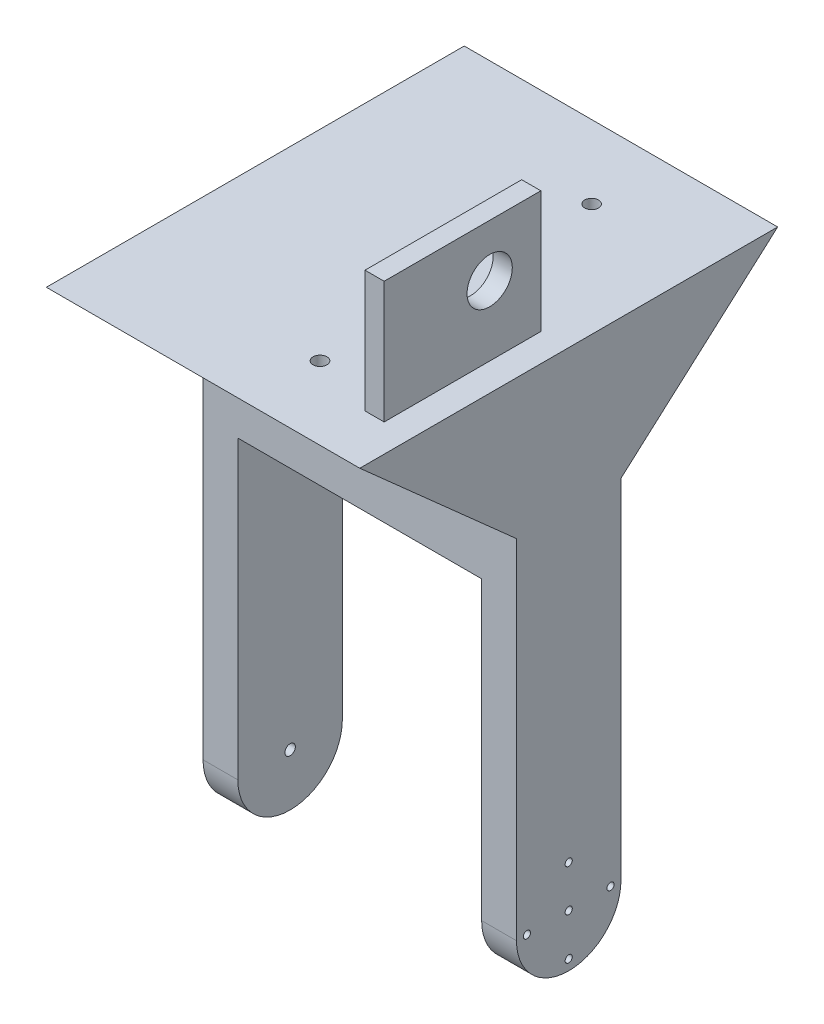
ISO-10303-21;
HEADER;
FILE_DESCRIPTION(('STEP AP214'),'2;1');
FILE_NAME('part.step','',(''),(''),'','','');
FILE_SCHEMA(('AUTOMOTIVE_DESIGN { 1 0 10303 214 1 1 1 1 }'));
ENDSEC;
DATA;
#1=APPLICATION_CONTEXT('core data for automotive mechanical design processes');
#2=APPLICATION_PROTOCOL_DEFINITION('international standard','automotive_design',2000,#1);
#3=PRODUCT_CONTEXT('',#1,'mechanical');
#4=PRODUCT('Part','Part','',(#3));
#5=PRODUCT_RELATED_PRODUCT_CATEGORY('part','',(#4));
#6=PRODUCT_DEFINITION_FORMATION('','',#4);
#7=PRODUCT_DEFINITION_CONTEXT('part definition',#1,'design');
#8=PRODUCT_DEFINITION('design','',#6,#7);
#9=PRODUCT_DEFINITION_SHAPE('','',#8);
#10=(LENGTH_UNIT() NAMED_UNIT(*) SI_UNIT(.MILLI.,.METRE.));
#11=(NAMED_UNIT(*) PLANE_ANGLE_UNIT() SI_UNIT($,.RADIAN.));
#12=(NAMED_UNIT(*) SI_UNIT($,.STERADIAN.) SOLID_ANGLE_UNIT());
#13=UNCERTAINTY_MEASURE_WITH_UNIT(LENGTH_MEASURE(1.E-05),#10,'distance_accuracy_value','');
#14=(GEOMETRIC_REPRESENTATION_CONTEXT(3) GLOBAL_UNCERTAINTY_ASSIGNED_CONTEXT((#13)) GLOBAL_UNIT_ASSIGNED_CONTEXT((#10,
#11,#12)) REPRESENTATION_CONTEXT('',''));
#15=CARTESIAN_POINT('',(0.,0.,0.));
#16=DIRECTION('',(0.,0.,1.));
#17=DIRECTION('',(1.,0.,0.));
#18=AXIS2_PLACEMENT_3D('',#15,#16,#17);
#19=CARTESIAN_POINT('',(0.,151.596692486498,-60.));
#20=DIRECTION('',(0.,1.,0.));
#21=DIRECTION('',(0.,0.,1.));
#22=AXIS2_PLACEMENT_3D('',#19,#20,#21);
#23=PLANE('',#22);
#24=CARTESIAN_POINT('',(-32.4216056612237,151.596692486498,-39.));
#25=DIRECTION('',(0.,1.,0.));
#26=DIRECTION('',(0.,0.,1.));
#27=AXIS2_PLACEMENT_3D('',#24,#25,#26);
#28=CIRCLE('',#27,1.99999999999952);
#29=CARTESIAN_POINT('',(-32.4216056612237,151.596692486498,-37.0000000000005));
#30=VERTEX_POINT('',#29);
#31=EDGE_CURVE('E289',#30,#30,#28,.T.);
#32=ORIENTED_EDGE('',*,*,#31,.F.);
#33=EDGE_LOOP('',(#32));
#34=FACE_BOUND('',#33,.T.);
#35=CARTESIAN_POINT('',(-32.4216056612237,151.596692486498,39.));
#36=DIRECTION('',(0.,1.,0.));
#37=DIRECTION('',(0.,0.,1.));
#38=AXIS2_PLACEMENT_3D('',#35,#36,#37);
#39=CIRCLE('',#38,1.99999999999948);
#40=CARTESIAN_POINT('',(-32.4216056612237,151.596692486498,40.9999999999995));
#41=VERTEX_POINT('',#40);
#42=EDGE_CURVE('E295',#41,#41,#39,.T.);
#43=ORIENTED_EDGE('',*,*,#42,.F.);
#44=EDGE_LOOP('',(#43));
#45=FACE_BOUND('',#44,.T.);
#46=DIRECTION('',(0.,0.,-1.));
#47=VECTOR('',#46,1.);
#48=CARTESIAN_POINT('',(-90.,151.596692486498,-60.));
#49=LINE('',#48,#47);
#50=CARTESIAN_POINT('',(-90.,151.596692486498,60.));
#51=VERTEX_POINT('',#50);
#52=CARTESIAN_POINT('',(-90.,151.596692486498,-60.));
#53=VERTEX_POINT('',#52);
#54=EDGE_CURVE('E170',#51,#53,#49,.T.);
#55=ORIENTED_EDGE('',*,*,#54,.F.);
#56=DIRECTION('',(-1.,0.,0.));
#57=VECTOR('',#56,1.);
#58=CARTESIAN_POINT('',(0.,151.596692486498,60.));
#59=LINE('',#58,#57);
#60=CARTESIAN_POINT('',(0.,151.596692486498,60.));
#61=VERTEX_POINT('',#60);
#62=EDGE_CURVE('E184',#61,#51,#59,.T.);
#63=ORIENTED_EDGE('',*,*,#62,.F.);
#64=DIRECTION('',(0.,0.,-1.));
#65=VECTOR('',#64,1.);
#66=CARTESIAN_POINT('',(0.,151.596692486498,-60.));
#67=LINE('',#66,#65);
#68=CARTESIAN_POINT('',(0.,151.596692486498,-60.));
#69=VERTEX_POINT('',#68);
#70=EDGE_CURVE('E178',#61,#69,#67,.T.);
#71=ORIENTED_EDGE('',*,*,#70,.T.);
#72=DIRECTION('',(-1.,0.,0.));
#73=VECTOR('',#72,1.);
#74=CARTESIAN_POINT('',(0.,151.596692486498,-60.));
#75=LINE('',#74,#73);
#76=EDGE_CURVE('E190',#69,#53,#75,.T.);
#77=ORIENTED_EDGE('',*,*,#76,.T.);
#78=EDGE_LOOP('',(#55,#63,#71,#77));
#79=FACE_BOUND('',#78,.T.);
#80=DIRECTION('',(-1.,0.,0.));
#81=VECTOR('',#80,1.);
#82=CARTESIAN_POINT('',(-8.,151.596692486498,0.));
#83=LINE('',#82,#81);
#84=CARTESIAN_POINT('',(-8.,151.596692486498,0.));
#85=VERTEX_POINT('',#84);
#86=CARTESIAN_POINT('',(-13.5,151.596692486498,0.));
#87=VERTEX_POINT('',#86);
#88=EDGE_CURVE('E311',#85,#87,#83,.T.);
#89=ORIENTED_EDGE('',*,*,#88,.F.);
#90=DIRECTION('',(0.,0.,-1.));
#91=VECTOR('',#90,1.);
#92=CARTESIAN_POINT('',(-8.,151.596692486498,45.));
#93=LINE('',#92,#91);
#94=CARTESIAN_POINT('',(-8.,151.596692486498,45.));
#95=VERTEX_POINT('',#94);
#96=EDGE_CURVE('E165',#95,#85,#93,.T.);
#97=ORIENTED_EDGE('',*,*,#96,.F.);
#98=DIRECTION('',(1.,0.,0.));
#99=VECTOR('',#98,1.);
#100=CARTESIAN_POINT('',(-8.,151.596692486498,45.));
#101=LINE('',#100,#99);
#102=CARTESIAN_POINT('',(-13.5,151.596692486498,45.));
#103=VERTEX_POINT('',#102);
#104=EDGE_CURVE('E161',#103,#95,#101,.T.);
#105=ORIENTED_EDGE('',*,*,#104,.F.);
#106=DIRECTION('',(0.,0.,1.));
#107=VECTOR('',#106,1.);
#108=CARTESIAN_POINT('',(-13.5,151.596692486498,45.));
#109=LINE('',#108,#107);
#110=EDGE_CURVE('E313',#87,#103,#109,.T.);
#111=ORIENTED_EDGE('',*,*,#110,.F.);
#112=EDGE_LOOP('',(#89,#97,#105,#111));
#113=FACE_BOUND('',#112,.T.);
#114=ADVANCED_FACE('F39',(#34,#45,#79,#113),#23,.T.);
#115=CARTESIAN_POINT('',(-10.,11.5966924864979,0.));
#116=DIRECTION('',(1.,0.,0.));
#117=DIRECTION('',(0.,0.,-1.));
#118=AXIS2_PLACEMENT_3D('',#115,#116,#117);
#119=PLANE('',#118);
#120=CARTESIAN_POINT('',(-10.,23.5966924864979,0.));
#121=DIRECTION('',(-1.,0.,0.));
#122=DIRECTION('',(0.,0.,1.));
#123=AXIS2_PLACEMENT_3D('',#120,#121,#122);
#124=CIRCLE('',#123,1.025);
#125=CARTESIAN_POINT('',(-10.,23.5966924864979,1.025));
#126=VERTEX_POINT('',#125);
#127=EDGE_CURVE('E204',#126,#126,#124,.T.);
#128=ORIENTED_EDGE('',*,*,#127,.F.);
#129=EDGE_LOOP('',(#128));
#130=FACE_BOUND('',#129,.T.);
#131=CARTESIAN_POINT('',(-10.,11.5966924864975,-11.9999999999995));
#132=DIRECTION('',(-1.,0.,0.));
#133=DIRECTION('',(0.,0.,1.));
#134=AXIS2_PLACEMENT_3D('',#131,#132,#133);
#135=CIRCLE('',#134,1.025);
#136=CARTESIAN_POINT('',(-10.,11.5966924864975,-10.9749999999995));
#137=VERTEX_POINT('',#136);
#138=EDGE_CURVE('E215',#137,#137,#135,.T.);
#139=ORIENTED_EDGE('',*,*,#138,.F.);
#140=EDGE_LOOP('',(#139));
#141=FACE_BOUND('',#140,.T.);
#142=CARTESIAN_POINT('',(-10.,-0.403307513502083,9.33507682726402E-13));
#143=DIRECTION('',(-1.,0.,0.));
#144=DIRECTION('',(0.,0.,1.));
#145=AXIS2_PLACEMENT_3D('',#142,#143,#144);
#146=CIRCLE('',#145,1.025);
#147=CARTESIAN_POINT('',(-10.,-0.403307513502083,1.02500000000093));
#148=VERTEX_POINT('',#147);
#149=EDGE_CURVE('E208',#148,#148,#146,.T.);
#150=ORIENTED_EDGE('',*,*,#149,.F.);
#151=EDGE_LOOP('',(#150));
#152=FACE_BOUND('',#151,.T.);
#153=CARTESIAN_POINT('',(-10.,11.5966924864984,12.0000000000005));
#154=DIRECTION('',(-1.,0.,0.));
#155=DIRECTION('',(0.,0.,1.));
#156=AXIS2_PLACEMENT_3D('',#153,#154,#155);
#157=CIRCLE('',#156,1.025);
#158=CARTESIAN_POINT('',(-10.,11.5966924864984,13.0250000000005));
#159=VERTEX_POINT('',#158);
#160=EDGE_CURVE('E222',#159,#159,#157,.T.);
#161=ORIENTED_EDGE('',*,*,#160,.F.);
#162=EDGE_LOOP('',(#161));
#163=FACE_BOUND('',#162,.T.);
#164=CARTESIAN_POINT('',(-10.,11.5966924864979,0.));
#165=DIRECTION('',(-1.,0.,0.));
#166=DIRECTION('',(0.,0.,1.));
#167=AXIS2_PLACEMENT_3D('',#164,#165,#166);
#168=CIRCLE('',#167,6.05);
#169=CARTESIAN_POINT('',(-10.,11.5966924864979,6.05));
#170=VERTEX_POINT('',#169);
#171=EDGE_CURVE('E231',#170,#170,#168,.T.);
#172=ORIENTED_EDGE('',*,*,#171,.F.);
#173=EDGE_LOOP('',(#172));
#174=FACE_BOUND('',#173,.T.);
#175=DIRECTION('',(0.,0.,1.));
#176=VECTOR('',#175,1.);
#177=CARTESIAN_POINT('',(-10.,96.5966924864979,-15.));
#178=LINE('',#177,#176);
#179=CARTESIAN_POINT('',(-10.,96.5966924864979,-15.));
#180=VERTEX_POINT('',#179);
#181=CARTESIAN_POINT('',(-10.,96.5966924864979,15.));
#182=VERTEX_POINT('',#181);
#183=EDGE_CURVE('E64',#180,#182,#178,.T.);
#184=ORIENTED_EDGE('',*,*,#183,.F.);
#185=DIRECTION('',(0.,1.,0.));
#186=VECTOR('',#185,1.);
#187=CARTESIAN_POINT('',(-10.,11.5966924864979,-15.));
#188=LINE('',#187,#186);
#189=CARTESIAN_POINT('',(-10.,11.5966924864979,-15.));
#190=VERTEX_POINT('',#189);
#191=EDGE_CURVE('E268',#190,#180,#188,.T.);
#192=ORIENTED_EDGE('',*,*,#191,.F.);
#193=CARTESIAN_POINT('',(-10.,11.5966924864979,0.));
#194=DIRECTION('',(1.,0.,0.));
#195=DIRECTION('',(0.,0.,-1.));
#196=AXIS2_PLACEMENT_3D('',#193,#194,#195);
#197=CIRCLE('',#196,15.);
#198=CARTESIAN_POINT('',(-10.,11.5966924864979,15.));
#199=VERTEX_POINT('',#198);
#200=EDGE_CURVE('E265',#199,#190,#197,.T.);
#201=ORIENTED_EDGE('',*,*,#200,.F.);
#202=DIRECTION('',(0.,-1.,0.));
#203=VECTOR('',#202,1.);
#204=CARTESIAN_POINT('',(-10.,11.5966924864979,15.));
#205=LINE('',#204,#203);
#206=EDGE_CURVE('E271',#182,#199,#205,.T.);
#207=ORIENTED_EDGE('',*,*,#206,.F.);
#208=EDGE_LOOP('',(#184,#192,#201,#207));
#209=FACE_BOUND('',#208,.T.);
#210=ADVANCED_FACE('F334',(#130,#141,#152,#163,#174,#209),#119,.F.);
#211=CARTESIAN_POINT('',(-10.,11.5966924864979,0.));
#212=DIRECTION('',(1.,0.,0.));
#213=DIRECTION('',(0.,0.,-1.));
#214=AXIS2_PLACEMENT_3D('',#211,#212,#213);
#215=CYLINDRICAL_SURFACE('',#214,15.);
#216=CARTESIAN_POINT('',(0.,11.5966924864979,0.));
#217=DIRECTION('',(1.,0.,0.));
#218=DIRECTION('',(0.,0.,-1.));
#219=AXIS2_PLACEMENT_3D('',#216,#217,#218);
#220=CIRCLE('',#219,15.);
#221=CARTESIAN_POINT('',(0.,11.5966924864979,15.));
#222=VERTEX_POINT('',#221);
#223=CARTESIAN_POINT('',(0.,11.5966924864979,-15.));
#224=VERTEX_POINT('',#223);
#225=EDGE_CURVE('E264',#222,#224,#220,.T.);
#226=ORIENTED_EDGE('',*,*,#225,.F.);
#227=DIRECTION('',(1.,0.,0.));
#228=VECTOR('',#227,1.);
#229=CARTESIAN_POINT('',(-10.,11.5966924864979,15.));
#230=LINE('',#229,#228);
#231=EDGE_CURVE('E11',#199,#222,#230,.T.);
#232=ORIENTED_EDGE('',*,*,#231,.F.);
#233=ORIENTED_EDGE('',*,*,#200,.T.);
#234=DIRECTION('',(1.,0.,0.));
#235=VECTOR('',#234,1.);
#236=CARTESIAN_POINT('',(-10.,11.5966924864979,-15.));
#237=LINE('',#236,#235);
#238=EDGE_CURVE('E273',#190,#224,#237,.T.);
#239=ORIENTED_EDGE('',*,*,#238,.T.);
#240=EDGE_LOOP('',(#226,#232,#233,#239));
#241=FACE_BOUND('',#240,.T.);
#242=ADVANCED_FACE('F41',(#241),#215,.T.);
#243=CARTESIAN_POINT('',(-10.,11.5966924864979,15.));
#244=DIRECTION('',(0.,0.,1.));
#245=DIRECTION('',(0.,-1.,0.));
#246=AXIS2_PLACEMENT_3D('',#243,#244,#245);
#247=PLANE('',#246);
#248=DIRECTION('',(0.,-1.,0.));
#249=VECTOR('',#248,1.);
#250=CARTESIAN_POINT('',(0.,11.5966924864979,15.));
#251=LINE('',#250,#249);
#252=CARTESIAN_POINT('',(0.,111.596692486498,15.));
#253=VERTEX_POINT('',#252);
#254=EDGE_CURVE('E269',#253,#222,#251,.T.);
#255=ORIENTED_EDGE('',*,*,#254,.F.);
#256=DIRECTION('',(1.,0.,0.));
#257=VECTOR('',#256,1.);
#258=CARTESIAN_POINT('',(-10.,111.596692486498,15.));
#259=LINE('',#258,#257);
#260=CARTESIAN_POINT('',(-90.,111.596692486498,15.));
#261=VERTEX_POINT('',#260);
#262=EDGE_CURVE('E48',#261,#253,#259,.T.);
#263=ORIENTED_EDGE('',*,*,#262,.F.);
#264=DIRECTION('',(0.,1.,0.));
#265=VECTOR('',#264,1.);
#266=CARTESIAN_POINT('',(-90.,111.596692486498,15.));
#267=LINE('',#266,#265);
#268=CARTESIAN_POINT('',(-90.,11.5966924864979,15.));
#269=VERTEX_POINT('',#268);
#270=EDGE_CURVE('E240',#269,#261,#267,.T.);
#271=ORIENTED_EDGE('',*,*,#270,.F.);
#272=DIRECTION('',(1.,0.,0.));
#273=VECTOR('',#272,1.);
#274=CARTESIAN_POINT('',(-90.,11.5966924864979,15.));
#275=LINE('',#274,#273);
#276=CARTESIAN_POINT('',(-80.,11.5966924864979,15.));
#277=VERTEX_POINT('',#276);
#278=EDGE_CURVE('E243',#269,#277,#275,.T.);
#279=ORIENTED_EDGE('',*,*,#278,.T.);
#280=DIRECTION('',(0.,1.,0.));
#281=VECTOR('',#280,1.);
#282=CARTESIAN_POINT('',(-80.,111.596692486498,15.));
#283=LINE('',#282,#281);
#284=CARTESIAN_POINT('',(-80.,96.5966924864979,15.));
#285=VERTEX_POINT('',#284);
#286=EDGE_CURVE('E238',#277,#285,#283,.T.);
#287=ORIENTED_EDGE('',*,*,#286,.T.);
#288=DIRECTION('',(1.,0.,0.));
#289=VECTOR('',#288,1.);
#290=CARTESIAN_POINT('',(-80.,96.5966924864979,15.));
#291=LINE('',#290,#289);
#292=EDGE_CURVE('E257',#285,#182,#291,.T.);
#293=ORIENTED_EDGE('',*,*,#292,.T.);
#294=ORIENTED_EDGE('',*,*,#206,.T.);
#295=ORIENTED_EDGE('',*,*,#231,.T.);
#296=EDGE_LOOP('',(#255,#263,#271,#279,#287,#293,#294,#295));
#297=FACE_BOUND('',#296,.T.);
#298=ADVANCED_FACE('F406',(#297),#247,.T.);
#299=CARTESIAN_POINT('',(-10.,11.5966924864979,-15.));
#300=DIRECTION('',(0.,0.,-1.));
#301=DIRECTION('',(0.,1.,0.));
#302=AXIS2_PLACEMENT_3D('',#299,#300,#301);
#303=PLANE('',#302);
#304=DIRECTION('',(0.,1.,0.));
#305=VECTOR('',#304,1.);
#306=CARTESIAN_POINT('',(0.,11.5966924864979,-15.));
#307=LINE('',#306,#305);
#308=CARTESIAN_POINT('',(0.,111.596692486498,-15.));
#309=VERTEX_POINT('',#308);
#310=EDGE_CURVE('E276',#224,#309,#307,.T.);
#311=ORIENTED_EDGE('',*,*,#310,.F.);
#312=ORIENTED_EDGE('',*,*,#238,.F.);
#313=ORIENTED_EDGE('',*,*,#191,.T.);
#314=DIRECTION('',(1.,0.,0.));
#315=VECTOR('',#314,1.);
#316=CARTESIAN_POINT('',(-80.,96.5966924864979,-15.));
#317=LINE('',#316,#315);
#318=CARTESIAN_POINT('',(-80.,96.5966924864979,-15.));
#319=VERTEX_POINT('',#318);
#320=EDGE_CURVE('E261',#319,#180,#317,.T.);
#321=ORIENTED_EDGE('',*,*,#320,.F.);
#322=DIRECTION('',(0.,-1.,0.));
#323=VECTOR('',#322,1.);
#324=CARTESIAN_POINT('',(-80.,111.596692486498,-15.));
#325=LINE('',#324,#323);
#326=CARTESIAN_POINT('',(-80.,11.5966924864979,-15.));
#327=VERTEX_POINT('',#326);
#328=EDGE_CURVE('E230',#319,#327,#325,.T.);
#329=ORIENTED_EDGE('',*,*,#328,.T.);
#330=DIRECTION('',(1.,0.,0.));
#331=VECTOR('',#330,1.);
#332=CARTESIAN_POINT('',(-90.,11.5966924864979,-15.));
#333=LINE('',#332,#331);
#334=CARTESIAN_POINT('',(-90.,11.5966924864979,-15.));
#335=VERTEX_POINT('',#334);
#336=EDGE_CURVE('E251',#335,#327,#333,.T.);
#337=ORIENTED_EDGE('',*,*,#336,.F.);
#338=DIRECTION('',(0.,-1.,0.));
#339=VECTOR('',#338,1.);
#340=CARTESIAN_POINT('',(-90.,111.596692486498,-15.));
#341=LINE('',#340,#339);
#342=CARTESIAN_POINT('',(-90.,111.596692486498,-15.));
#343=VERTEX_POINT('',#342);
#344=EDGE_CURVE('E234',#343,#335,#341,.T.);
#345=ORIENTED_EDGE('',*,*,#344,.F.);
#346=DIRECTION('',(1.,0.,0.));
#347=VECTOR('',#346,1.);
#348=CARTESIAN_POINT('',(-10.,111.596692486498,-15.));
#349=LINE('',#348,#347);
#350=EDGE_CURVE('E283',#343,#309,#349,.T.);
#351=ORIENTED_EDGE('',*,*,#350,.T.);
#352=EDGE_LOOP('',(#311,#312,#313,#321,#329,#337,#345,#351));
#353=FACE_BOUND('',#352,.T.);
#354=ADVANCED_FACE('F404',(#353),#303,.T.);
#355=CARTESIAN_POINT('',(0.,11.5966924864979,0.));
#356=DIRECTION('',(1.,0.,0.));
#357=DIRECTION('',(0.,0.,-1.));
#358=AXIS2_PLACEMENT_3D('',#355,#356,#357);
#359=PLANE('',#358);
#360=CARTESIAN_POINT('',(0.,23.5966924864979,0.));
#361=DIRECTION('',(-1.,0.,0.));
#362=DIRECTION('',(0.,0.,1.));
#363=AXIS2_PLACEMENT_3D('',#360,#361,#362);
#364=CIRCLE('',#363,1.025);
#365=CARTESIAN_POINT('',(0.,23.5966924864979,1.025));
#366=VERTEX_POINT('',#365);
#367=EDGE_CURVE('E200',#366,#366,#364,.T.);
#368=ORIENTED_EDGE('',*,*,#367,.T.);
#369=EDGE_LOOP('',(#368));
#370=FACE_BOUND('',#369,.T.);
#371=CARTESIAN_POINT('',(0.,11.5966924864975,-11.9999999999995));
#372=DIRECTION('',(-1.,0.,0.));
#373=DIRECTION('',(0.,0.,1.));
#374=AXIS2_PLACEMENT_3D('',#371,#372,#373);
#375=CIRCLE('',#374,1.025);
#376=CARTESIAN_POINT('',(0.,11.5966924864975,-10.9749999999995));
#377=VERTEX_POINT('',#376);
#378=EDGE_CURVE('E199',#377,#377,#375,.T.);
#379=ORIENTED_EDGE('',*,*,#378,.T.);
#380=EDGE_LOOP('',(#379));
#381=FACE_BOUND('',#380,.T.);
#382=CARTESIAN_POINT('',(0.,-0.403307513502083,9.33507682726402E-13));
#383=DIRECTION('',(-1.,0.,0.));
#384=DIRECTION('',(0.,0.,1.));
#385=AXIS2_PLACEMENT_3D('',#382,#383,#384);
#386=CIRCLE('',#385,1.025);
#387=CARTESIAN_POINT('',(0.,-0.403307513502083,1.02500000000093));
#388=VERTEX_POINT('',#387);
#389=EDGE_CURVE('E212',#388,#388,#386,.T.);
#390=ORIENTED_EDGE('',*,*,#389,.T.);
#391=EDGE_LOOP('',(#390));
#392=FACE_BOUND('',#391,.T.);
#393=CARTESIAN_POINT('',(0.,11.5966924864984,12.0000000000005));
#394=DIRECTION('',(-1.,0.,0.));
#395=DIRECTION('',(0.,0.,1.));
#396=AXIS2_PLACEMENT_3D('',#393,#394,#395);
#397=CIRCLE('',#396,1.025);
#398=CARTESIAN_POINT('',(0.,11.5966924864984,13.0250000000005));
#399=VERTEX_POINT('',#398);
#400=EDGE_CURVE('E211',#399,#399,#397,.T.);
#401=ORIENTED_EDGE('',*,*,#400,.T.);
#402=EDGE_LOOP('',(#401));
#403=FACE_BOUND('',#402,.T.);
#404=CARTESIAN_POINT('',(0.,11.5966924864979,5.08651617429319E-13));
#405=DIRECTION('',(-1.,0.,0.));
#406=DIRECTION('',(0.,0.,1.));
#407=AXIS2_PLACEMENT_3D('',#404,#405,#406);
#408=CIRCLE('',#407,1.025);
#409=CARTESIAN_POINT('',(0.,11.5966924864979,1.02500000000051));
#410=VERTEX_POINT('',#409);
#411=EDGE_CURVE('E207',#410,#410,#408,.T.);
#412=ORIENTED_EDGE('',*,*,#411,.T.);
#413=EDGE_LOOP('',(#412));
#414=FACE_BOUND('',#413,.T.);
#415=ORIENTED_EDGE('',*,*,#225,.T.);
#416=ORIENTED_EDGE('',*,*,#310,.T.);
#417=DIRECTION('',(0.,-0.66436383882992,0.74740931868366));
#418=VECTOR('',#417,1.);
#419=CARTESIAN_POINT('',(0.,111.596692486498,-15.));
#420=LINE('',#419,#418);
#421=EDGE_CURVE('E182',#69,#309,#420,.T.);
#422=ORIENTED_EDGE('',*,*,#421,.F.);
#423=ORIENTED_EDGE('',*,*,#70,.F.);
#424=DIRECTION('',(0.,0.66436383882992,0.74740931868366));
#425=VECTOR('',#424,1.);
#426=CARTESIAN_POINT('',(0.,151.596692486498,60.));
#427=LINE('',#426,#425);
#428=EDGE_CURVE('E175',#253,#61,#427,.T.);
#429=ORIENTED_EDGE('',*,*,#428,.F.);
#430=ORIENTED_EDGE('',*,*,#254,.T.);
#431=EDGE_LOOP('',(#415,#416,#422,#423,#429,#430));
#432=FACE_BOUND('',#431,.T.);
#433=ADVANCED_FACE('F399',(#370,#381,#392,#403,#414,#432),#359,.T.);
#434=CARTESIAN_POINT('',(-80.,96.5966924864979,-15.));
#435=DIRECTION('',(0.,1.,0.));
#436=DIRECTION('',(0.,0.,1.));
#437=AXIS2_PLACEMENT_3D('',#434,#435,#436);
#438=PLANE('',#437);
#439=ORIENTED_EDGE('',*,*,#183,.T.);
#440=ORIENTED_EDGE('',*,*,#292,.F.);
#441=DIRECTION('',(0.,0.,1.));
#442=VECTOR('',#441,1.);
#443=CARTESIAN_POINT('',(-80.,96.5966924864979,-15.));
#444=LINE('',#443,#442);
#445=EDGE_CURVE('E254',#319,#285,#444,.T.);
#446=ORIENTED_EDGE('',*,*,#445,.F.);
#447=ORIENTED_EDGE('',*,*,#320,.T.);
#448=EDGE_LOOP('',(#439,#440,#446,#447));
#449=FACE_BOUND('',#448,.T.);
#450=ADVANCED_FACE('F393',(#449),#438,.F.);
#451=CARTESIAN_POINT('',(-80.,11.5966924864979,0.));
#452=DIRECTION('',(-1.,0.,0.));
#453=DIRECTION('',(0.,0.,1.));
#454=AXIS2_PLACEMENT_3D('',#451,#452,#453);
#455=PLANE('',#454);
#456=CARTESIAN_POINT('',(-80.,11.5966924864987,3.33066907387547E-13));
#457=DIRECTION('',(-1.,0.,0.));
#458=DIRECTION('',(0.,0.,1.));
#459=AXIS2_PLACEMENT_3D('',#456,#457,#458);
#460=CIRCLE('',#459,1.5);
#461=CARTESIAN_POINT('',(-80.,11.5966924864987,1.50000000000033));
#462=VERTEX_POINT('',#461);
#463=EDGE_CURVE('E196',#462,#462,#460,.F.);
#464=ORIENTED_EDGE('',*,*,#463,.F.);
#465=EDGE_LOOP('',(#464));
#466=FACE_BOUND('',#465,.T.);
#467=ORIENTED_EDGE('',*,*,#328,.F.);
#468=ORIENTED_EDGE('',*,*,#445,.T.);
#469=ORIENTED_EDGE('',*,*,#286,.F.);
#470=CARTESIAN_POINT('',(-80.,11.5966924864979,0.));
#471=DIRECTION('',(-1.,0.,0.));
#472=DIRECTION('',(0.,0.,1.));
#473=AXIS2_PLACEMENT_3D('',#470,#471,#472);
#474=CIRCLE('',#473,15.);
#475=EDGE_CURVE('E245',#327,#277,#474,.T.);
#476=ORIENTED_EDGE('',*,*,#475,.F.);
#477=EDGE_LOOP('',(#467,#468,#469,#476));
#478=FACE_BOUND('',#477,.T.);
#479=ADVANCED_FACE('F390',(#466,#478),#455,.F.);
#480=CARTESIAN_POINT('',(-90.,11.5966924864979,0.));
#481=DIRECTION('',(1.,0.,0.));
#482=DIRECTION('',(0.,0.,-1.));
#483=AXIS2_PLACEMENT_3D('',#480,#481,#482);
#484=CYLINDRICAL_SURFACE('',#483,15.);
#485=ORIENTED_EDGE('',*,*,#475,.T.);
#486=ORIENTED_EDGE('',*,*,#278,.F.);
#487=CARTESIAN_POINT('',(-90.,11.5966924864979,0.));
#488=DIRECTION('',(-1.,0.,0.));
#489=DIRECTION('',(0.,0.,1.));
#490=AXIS2_PLACEMENT_3D('',#487,#488,#489);
#491=CIRCLE('',#490,15.);
#492=EDGE_CURVE('E237',#335,#269,#491,.T.);
#493=ORIENTED_EDGE('',*,*,#492,.F.);
#494=ORIENTED_EDGE('',*,*,#336,.T.);
#495=EDGE_LOOP('',(#485,#486,#493,#494));
#496=FACE_BOUND('',#495,.T.);
#497=ADVANCED_FACE('F388',(#496),#484,.T.);
#498=CARTESIAN_POINT('',(-90.,11.5966924864979,0.));
#499=DIRECTION('',(-1.,0.,0.));
#500=DIRECTION('',(0.,0.,1.));
#501=AXIS2_PLACEMENT_3D('',#498,#499,#500);
#502=PLANE('',#501);
#503=CARTESIAN_POINT('',(-90.,11.5966924864987,3.33066907387547E-13));
#504=DIRECTION('',(-1.,0.,0.));
#505=DIRECTION('',(0.,0.,1.));
#506=AXIS2_PLACEMENT_3D('',#503,#504,#505);
#507=CIRCLE('',#506,1.5);
#508=CARTESIAN_POINT('',(-90.,11.5966924864987,1.50000000000033));
#509=VERTEX_POINT('',#508);
#510=EDGE_CURVE('E192',#509,#509,#507,.T.);
#511=ORIENTED_EDGE('',*,*,#510,.F.);
#512=EDGE_LOOP('',(#511));
#513=FACE_BOUND('',#512,.T.);
#514=ORIENTED_EDGE('',*,*,#344,.T.);
#515=ORIENTED_EDGE('',*,*,#492,.T.);
#516=ORIENTED_EDGE('',*,*,#270,.T.);
#517=DIRECTION('',(0.,0.66436383882992,0.74740931868366));
#518=VECTOR('',#517,1.);
#519=CARTESIAN_POINT('',(-90.,151.596692486498,60.));
#520=LINE('',#519,#518);
#521=EDGE_CURVE('E167',#261,#51,#520,.T.);
#522=ORIENTED_EDGE('',*,*,#521,.T.);
#523=ORIENTED_EDGE('',*,*,#54,.T.);
#524=DIRECTION('',(0.,-0.66436383882992,0.74740931868366));
#525=VECTOR('',#524,1.);
#526=CARTESIAN_POINT('',(-90.,111.596692486498,-15.));
#527=LINE('',#526,#525);
#528=EDGE_CURVE('E179',#53,#343,#527,.T.);
#529=ORIENTED_EDGE('',*,*,#528,.T.);
#530=EDGE_LOOP('',(#514,#515,#516,#522,#523,#529));
#531=FACE_BOUND('',#530,.T.);
#532=ADVANCED_FACE('F384',(#513,#531),#502,.T.);
#533=CARTESIAN_POINT('',(-7.,11.5966924864979,0.));
#534=DIRECTION('',(-1.,0.,0.));
#535=DIRECTION('',(0.,0.,1.));
#536=AXIS2_PLACEMENT_3D('',#533,#534,#535);
#537=CYLINDRICAL_SURFACE('',#536,6.05);
#538=CARTESIAN_POINT('',(-7.,11.5966924864979,0.));
#539=DIRECTION('',(-1.,0.,0.));
#540=DIRECTION('',(0.,0.,1.));
#541=AXIS2_PLACEMENT_3D('',#538,#539,#540);
#542=CIRCLE('',#541,6.05);
#543=CARTESIAN_POINT('',(-7.,11.5966924864979,6.05));
#544=VERTEX_POINT('',#543);
#545=EDGE_CURVE('E227',#544,#544,#542,.T.);
#546=ORIENTED_EDGE('',*,*,#545,.F.);
#547=EDGE_LOOP('',(#546));
#548=FACE_BOUND('',#547,.T.);
#549=ORIENTED_EDGE('',*,*,#171,.T.);
#550=EDGE_LOOP('',(#549));
#551=FACE_BOUND('',#550,.T.);
#552=ADVANCED_FACE('F380',(#548,#551),#537,.F.);
#553=CARTESIAN_POINT('',(-7.,0.,0.));
#554=DIRECTION('',(-1.,0.,0.));
#555=DIRECTION('',(0.,0.,1.));
#556=AXIS2_PLACEMENT_3D('',#553,#554,#555);
#557=PLANE('',#556);
#558=CARTESIAN_POINT('',(-7.,11.5966924864979,5.08651617429319E-13));
#559=DIRECTION('',(-1.,0.,0.));
#560=DIRECTION('',(0.,0.,1.));
#561=AXIS2_PLACEMENT_3D('',#558,#559,#560);
#562=CIRCLE('',#561,1.025);
#563=CARTESIAN_POINT('',(-7.,11.5966924864979,1.02500000000051));
#564=VERTEX_POINT('',#563);
#565=EDGE_CURVE('E203',#564,#564,#562,.T.);
#566=ORIENTED_EDGE('',*,*,#565,.F.);
#567=EDGE_LOOP('',(#566));
#568=FACE_BOUND('',#567,.T.);
#569=ORIENTED_EDGE('',*,*,#545,.T.);
#570=EDGE_LOOP('',(#569));
#571=FACE_BOUND('',#570,.T.);
#572=ADVANCED_FACE('F373',(#568,#571),#557,.T.);
#573=CARTESIAN_POINT('',(0.,11.5966924864979,5.08651617429319E-13));
#574=DIRECTION('',(-1.,0.,0.));
#575=DIRECTION('',(0.,0.,1.));
#576=AXIS2_PLACEMENT_3D('',#573,#574,#575);
#577=CYLINDRICAL_SURFACE('',#576,1.025);
#578=ORIENTED_EDGE('',*,*,#565,.T.);
#579=EDGE_LOOP('',(#578));
#580=FACE_BOUND('',#579,.T.);
#581=ORIENTED_EDGE('',*,*,#411,.F.);
#582=EDGE_LOOP('',(#581));
#583=FACE_BOUND('',#582,.T.);
#584=ADVANCED_FACE('F370',(#580,#583),#577,.F.);
#585=CARTESIAN_POINT('',(0.,11.5966924864984,12.0000000000005));
#586=DIRECTION('',(-1.,0.,0.));
#587=DIRECTION('',(0.,0.,1.));
#588=AXIS2_PLACEMENT_3D('',#585,#586,#587);
#589=CYLINDRICAL_SURFACE('',#588,1.025);
#590=ORIENTED_EDGE('',*,*,#400,.F.);
#591=EDGE_LOOP('',(#590));
#592=FACE_BOUND('',#591,.T.);
#593=ORIENTED_EDGE('',*,*,#160,.T.);
#594=EDGE_LOOP('',(#593));
#595=FACE_BOUND('',#594,.T.);
#596=ADVANCED_FACE('F365',(#592,#595),#589,.F.);
#597=CARTESIAN_POINT('',(0.,-0.403307513502083,9.33507682726402E-13));
#598=DIRECTION('',(-1.,0.,0.));
#599=DIRECTION('',(0.,0.,1.));
#600=AXIS2_PLACEMENT_3D('',#597,#598,#599);
#601=CYLINDRICAL_SURFACE('',#600,1.025);
#602=ORIENTED_EDGE('',*,*,#389,.F.);
#603=EDGE_LOOP('',(#602));
#604=FACE_BOUND('',#603,.T.);
#605=ORIENTED_EDGE('',*,*,#149,.T.);
#606=EDGE_LOOP('',(#605));
#607=FACE_BOUND('',#606,.T.);
#608=ADVANCED_FACE('F362',(#604,#607),#601,.F.);
#609=CARTESIAN_POINT('',(0.,11.5966924864975,-11.9999999999995));
#610=DIRECTION('',(-1.,0.,0.));
#611=DIRECTION('',(0.,0.,1.));
#612=AXIS2_PLACEMENT_3D('',#609,#610,#611);
#613=CYLINDRICAL_SURFACE('',#612,1.025);
#614=ORIENTED_EDGE('',*,*,#378,.F.);
#615=EDGE_LOOP('',(#614));
#616=FACE_BOUND('',#615,.T.);
#617=ORIENTED_EDGE('',*,*,#138,.T.);
#618=EDGE_LOOP('',(#617));
#619=FACE_BOUND('',#618,.T.);
#620=ADVANCED_FACE('F360',(#616,#619),#613,.F.);
#621=CARTESIAN_POINT('',(0.,23.5966924864979,0.));
#622=DIRECTION('',(-1.,0.,0.));
#623=DIRECTION('',(0.,0.,1.));
#624=AXIS2_PLACEMENT_3D('',#621,#622,#623);
#625=CYLINDRICAL_SURFACE('',#624,1.025);
#626=ORIENTED_EDGE('',*,*,#367,.F.);
#627=EDGE_LOOP('',(#626));
#628=FACE_BOUND('',#627,.T.);
#629=ORIENTED_EDGE('',*,*,#127,.T.);
#630=EDGE_LOOP('',(#629));
#631=FACE_BOUND('',#630,.T.);
#632=ADVANCED_FACE('F356',(#628,#631),#625,.F.);
#633=CARTESIAN_POINT('',(-75.7573593128807,11.5966924864987,3.33066907387547E-13));
#634=DIRECTION('',(-1.,0.,0.));
#635=DIRECTION('',(0.,0.,1.));
#636=AXIS2_PLACEMENT_3D('',#633,#634,#635);
#637=CYLINDRICAL_SURFACE('',#636,1.5);
#638=ORIENTED_EDGE('',*,*,#463,.T.);
#639=EDGE_LOOP('',(#638));
#640=FACE_BOUND('',#639,.T.);
#641=ORIENTED_EDGE('',*,*,#510,.T.);
#642=EDGE_LOOP('',(#641));
#643=FACE_BOUND('',#642,.T.);
#644=ADVANCED_FACE('F353',(#640,#643),#637,.F.);
#645=CARTESIAN_POINT('',(0.,111.596692486498,-15.));
#646=DIRECTION('',(0.,-0.74740931868366,-0.66436383882992));
#647=DIRECTION('',(0.,0.66436383882992,-0.74740931868366));
#648=AXIS2_PLACEMENT_3D('',#645,#646,#647);
#649=PLANE('',#648);
#650=CARTESIAN_POINT('',(-32.4216056612237,132.930025819831,-39.));
#651=DIRECTION('',(0.,-0.74740931868366,-0.66436383882992));
#652=DIRECTION('',(0.,0.66436383882992,-0.74740931868366));
#653=AXIS2_PLACEMENT_3D('',#650,#651,#652);
#654=ELLIPSE('',#653,2.67590990639764,1.99999999999952);
#655=CARTESIAN_POINT('',(-32.4216056612237,134.707803597609,-40.9999999999996));
#656=VERTEX_POINT('',#655);
#657=EDGE_CURVE('E43',#656,#656,#654,.T.);
#658=ORIENTED_EDGE('',*,*,#657,.F.);
#659=EDGE_LOOP('',(#658));
#660=FACE_BOUND('',#659,.T.);
#661=ORIENTED_EDGE('',*,*,#528,.F.);
#662=ORIENTED_EDGE('',*,*,#76,.F.);
#663=ORIENTED_EDGE('',*,*,#421,.T.);
#664=ORIENTED_EDGE('',*,*,#350,.F.);
#665=EDGE_LOOP('',(#661,#662,#663,#664));
#666=FACE_BOUND('',#665,.T.);
#667=ADVANCED_FACE('F347',(#660,#666),#649,.T.);
#668=CARTESIAN_POINT('',(0.,151.596692486498,60.));
#669=DIRECTION('',(0.,-0.74740931868366,0.66436383882992));
#670=DIRECTION('',(0.,-0.66436383882992,-0.74740931868366));
#671=AXIS2_PLACEMENT_3D('',#668,#669,#670);
#672=PLANE('',#671);
#673=CARTESIAN_POINT('',(-32.4216056612237,132.930025819831,39.));
#674=DIRECTION('',(0.,-0.74740931868366,0.66436383882992));
#675=DIRECTION('',(0.,0.66436383882992,0.74740931868366));
#676=AXIS2_PLACEMENT_3D('',#673,#674,#675);
#677=ELLIPSE('',#676,2.6759099063976,1.99999999999948);
#678=CARTESIAN_POINT('',(-32.4216056612237,134.707803597609,40.9999999999995));
#679=VERTEX_POINT('',#678);
#680=EDGE_CURVE('E287',#679,#679,#677,.T.);
#681=ORIENTED_EDGE('',*,*,#680,.F.);
#682=EDGE_LOOP('',(#681));
#683=FACE_BOUND('',#682,.T.);
#684=ORIENTED_EDGE('',*,*,#521,.F.);
#685=ORIENTED_EDGE('',*,*,#262,.T.);
#686=ORIENTED_EDGE('',*,*,#428,.T.);
#687=ORIENTED_EDGE('',*,*,#62,.T.);
#688=EDGE_LOOP('',(#684,#685,#686,#687));
#689=FACE_BOUND('',#688,.T.);
#690=ADVANCED_FACE('F349',(#683,#689),#672,.T.);
#691=CARTESIAN_POINT('',(-8.,186.596692486498,45.));
#692=DIRECTION('',(-1.,0.,0.));
#693=DIRECTION('',(0.,0.,1.));
#694=AXIS2_PLACEMENT_3D('',#691,#692,#693);
#695=PLANE('',#694);
#696=CARTESIAN_POINT('',(-8.,171.596692486498,14.7));
#697=DIRECTION('',(1.,0.,0.));
#698=DIRECTION('',(0.,0.,-1.));
#699=AXIS2_PLACEMENT_3D('',#696,#697,#698);
#700=CIRCLE('',#699,6.5);
#701=CARTESIAN_POINT('',(-8.,171.596692486498,8.2));
#702=VERTEX_POINT('',#701);
#703=EDGE_CURVE('E293',#702,#702,#700,.T.);
#704=ORIENTED_EDGE('',*,*,#703,.F.);
#705=EDGE_LOOP('',(#704));
#706=FACE_BOUND('',#705,.T.);
#707=ORIENTED_EDGE('',*,*,#96,.T.);
#708=DIRECTION('',(0.,-1.,0.));
#709=VECTOR('',#708,1.);
#710=CARTESIAN_POINT('',(-8.,186.596692486498,0.));
#711=LINE('',#710,#709);
#712=CARTESIAN_POINT('',(-8.,186.596692486498,0.));
#713=VERTEX_POINT('',#712);
#714=EDGE_CURVE('E146',#713,#85,#711,.T.);
#715=ORIENTED_EDGE('',*,*,#714,.F.);
#716=DIRECTION('',(0.,0.,-1.));
#717=VECTOR('',#716,1.);
#718=CARTESIAN_POINT('',(-8.,186.596692486498,45.));
#719=LINE('',#718,#717);
#720=CARTESIAN_POINT('',(-8.,186.596692486498,45.));
#721=VERTEX_POINT('',#720);
#722=EDGE_CURVE('E153',#721,#713,#719,.T.);
#723=ORIENTED_EDGE('',*,*,#722,.F.);
#724=DIRECTION('',(0.,-1.,0.));
#725=VECTOR('',#724,1.);
#726=CARTESIAN_POINT('',(-8.,186.596692486498,45.));
#727=LINE('',#726,#725);
#728=EDGE_CURVE('E309',#721,#95,#727,.T.);
#729=ORIENTED_EDGE('',*,*,#728,.T.);
#730=EDGE_LOOP('',(#707,#715,#723,#729));
#731=FACE_BOUND('',#730,.T.);
#732=ADVANCED_FACE('F163',(#706,#731),#695,.F.);
#733=CARTESIAN_POINT('',(-8.,186.596692486498,0.));
#734=DIRECTION('',(0.,0.,1.));
#735=DIRECTION('',(1.,0.,0.));
#736=AXIS2_PLACEMENT_3D('',#733,#734,#735);
#737=PLANE('',#736);
#738=ORIENTED_EDGE('',*,*,#88,.T.);
#739=DIRECTION('',(0.,-1.,0.));
#740=VECTOR('',#739,1.);
#741=CARTESIAN_POINT('',(-13.5,186.596692486498,0.));
#742=LINE('',#741,#740);
#743=CARTESIAN_POINT('',(-13.5,186.596692486498,0.));
#744=VERTEX_POINT('',#743);
#745=EDGE_CURVE('E149',#744,#87,#742,.T.);
#746=ORIENTED_EDGE('',*,*,#745,.F.);
#747=DIRECTION('',(-1.,0.,0.));
#748=VECTOR('',#747,1.);
#749=CARTESIAN_POINT('',(-8.,186.596692486498,0.));
#750=LINE('',#749,#748);
#751=EDGE_CURVE('E142',#713,#744,#750,.T.);
#752=ORIENTED_EDGE('',*,*,#751,.F.);
#753=ORIENTED_EDGE('',*,*,#714,.T.);
#754=EDGE_LOOP('',(#738,#746,#752,#753));
#755=FACE_BOUND('',#754,.T.);
#756=ADVANCED_FACE('F144',(#755),#737,.F.);
#757=CARTESIAN_POINT('',(-13.5,186.596692486498,45.));
#758=DIRECTION('',(1.,0.,0.));
#759=DIRECTION('',(0.,0.,-1.));
#760=AXIS2_PLACEMENT_3D('',#757,#758,#759);
#761=PLANE('',#760);
#762=CARTESIAN_POINT('',(-13.5,171.596692486498,14.7));
#763=DIRECTION('',(1.,0.,0.));
#764=DIRECTION('',(0.,0.,-1.));
#765=AXIS2_PLACEMENT_3D('',#762,#763,#764);
#766=CIRCLE('',#765,6.5);
#767=CARTESIAN_POINT('',(-13.5,171.596692486498,8.2));
#768=VERTEX_POINT('',#767);
#769=EDGE_CURVE('E304',#768,#768,#766,.F.);
#770=ORIENTED_EDGE('',*,*,#769,.F.);
#771=EDGE_LOOP('',(#770));
#772=FACE_BOUND('',#771,.T.);
#773=ORIENTED_EDGE('',*,*,#110,.T.);
#774=DIRECTION('',(0.,-1.,0.));
#775=VECTOR('',#774,1.);
#776=CARTESIAN_POINT('',(-13.5,186.596692486498,45.));
#777=LINE('',#776,#775);
#778=CARTESIAN_POINT('',(-13.5,186.596692486498,45.));
#779=VERTEX_POINT('',#778);
#780=EDGE_CURVE('E56',#779,#103,#777,.T.);
#781=ORIENTED_EDGE('',*,*,#780,.F.);
#782=DIRECTION('',(0.,0.,1.));
#783=VECTOR('',#782,1.);
#784=CARTESIAN_POINT('',(-13.5,186.596692486498,45.));
#785=LINE('',#784,#783);
#786=EDGE_CURVE('E152',#744,#779,#785,.T.);
#787=ORIENTED_EDGE('',*,*,#786,.F.);
#788=ORIENTED_EDGE('',*,*,#745,.T.);
#789=EDGE_LOOP('',(#773,#781,#787,#788));
#790=FACE_BOUND('',#789,.T.);
#791=ADVANCED_FACE('F320',(#772,#790),#761,.F.);
#792=CARTESIAN_POINT('',(-8.,186.596692486498,45.));
#793=DIRECTION('',(0.,0.,-1.));
#794=DIRECTION('',(-1.,0.,0.));
#795=AXIS2_PLACEMENT_3D('',#792,#793,#794);
#796=PLANE('',#795);
#797=ORIENTED_EDGE('',*,*,#104,.T.);
#798=ORIENTED_EDGE('',*,*,#728,.F.);
#799=DIRECTION('',(1.,0.,0.));
#800=VECTOR('',#799,1.);
#801=CARTESIAN_POINT('',(-8.,186.596692486498,45.));
#802=LINE('',#801,#800);
#803=EDGE_CURVE('E157',#779,#721,#802,.T.);
#804=ORIENTED_EDGE('',*,*,#803,.F.);
#805=ORIENTED_EDGE('',*,*,#780,.T.);
#806=EDGE_LOOP('',(#797,#798,#804,#805));
#807=FACE_BOUND('',#806,.T.);
#808=ADVANCED_FACE('F321',(#807),#796,.F.);
#809=CARTESIAN_POINT('',(0.,186.596692486498,0.));
#810=DIRECTION('',(0.,1.,0.));
#811=DIRECTION('',(0.,0.,1.));
#812=AXIS2_PLACEMENT_3D('',#809,#810,#811);
#813=PLANE('',#812);
#814=ORIENTED_EDGE('',*,*,#722,.T.);
#815=ORIENTED_EDGE('',*,*,#751,.T.);
#816=ORIENTED_EDGE('',*,*,#786,.T.);
#817=ORIENTED_EDGE('',*,*,#803,.T.);
#818=EDGE_LOOP('',(#814,#815,#816,#817));
#819=FACE_BOUND('',#818,.T.);
#820=ADVANCED_FACE('F156',(#819),#813,.T.);
#821=CARTESIAN_POINT('',(-31.8847763108503,171.596692486498,14.7));
#822=DIRECTION('',(1.,0.,0.));
#823=DIRECTION('',(0.,0.,-1.));
#824=AXIS2_PLACEMENT_3D('',#821,#822,#823);
#825=CYLINDRICAL_SURFACE('',#824,6.5);
#826=ORIENTED_EDGE('',*,*,#769,.T.);
#827=EDGE_LOOP('',(#826));
#828=FACE_BOUND('',#827,.T.);
#829=ORIENTED_EDGE('',*,*,#703,.T.);
#830=EDGE_LOOP('',(#829));
#831=FACE_BOUND('',#830,.T.);
#832=ADVANCED_FACE('F328',(#828,#831),#825,.F.);
#833=CARTESIAN_POINT('',(-32.4216056612237,117.596692486498,39.));
#834=DIRECTION('',(0.,1.,0.));
#835=DIRECTION('',(0.,0.,1.));
#836=AXIS2_PLACEMENT_3D('',#833,#834,#835);
#837=CYLINDRICAL_SURFACE('',#836,1.99999999999948);
#838=ORIENTED_EDGE('',*,*,#680,.T.);
#839=EDGE_LOOP('',(#838));
#840=FACE_BOUND('',#839,.T.);
#841=ORIENTED_EDGE('',*,*,#42,.T.);
#842=EDGE_LOOP('',(#841));
#843=FACE_BOUND('',#842,.T.);
#844=ADVANCED_FACE('F445',(#840,#843),#837,.F.);
#845=CARTESIAN_POINT('',(-32.4216056612237,117.596692486498,-39.));
#846=DIRECTION('',(0.,1.,0.));
#847=DIRECTION('',(0.,0.,1.));
#848=AXIS2_PLACEMENT_3D('',#845,#846,#847);
#849=CYLINDRICAL_SURFACE('',#848,1.99999999999952);
#850=ORIENTED_EDGE('',*,*,#657,.T.);
#851=EDGE_LOOP('',(#850));
#852=FACE_BOUND('',#851,.T.);
#853=ORIENTED_EDGE('',*,*,#31,.T.);
#854=EDGE_LOOP('',(#853));
#855=FACE_BOUND('',#854,.T.);
#856=ADVANCED_FACE('F443',(#852,#855),#849,.F.);
#857=CLOSED_SHELL('',(#114,#210,#242,#298,#354,#433,#450,#479,#497,#532,#552,#572,#584,#596,
#608,#620,#632,#644,#667,#690,#732,#756,#791,#808,#820,#832,#844,#856));
#858=MANIFOLD_SOLID_BREP('B2',#857);
#859=ADVANCED_BREP_SHAPE_REPRESENTATION('',(#18,#858),#14);
#860=SHAPE_DEFINITION_REPRESENTATION(#9,#859);
ENDSEC;
END-ISO-10303-21;
